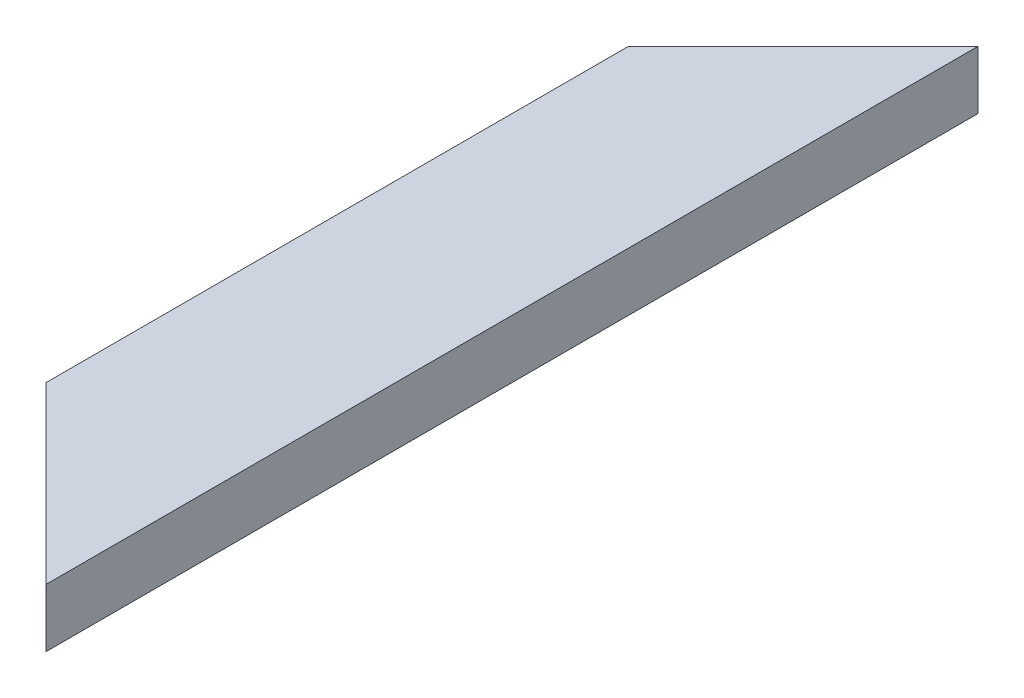
ISO-10303-21;
HEADER;
FILE_DESCRIPTION(('STEP AP214'),'2;1');
FILE_NAME('part.step','',(''),(''),'','','');
FILE_SCHEMA(('AUTOMOTIVE_DESIGN { 1 0 10303 214 1 1 1 1 }'));
ENDSEC;
DATA;
#1=APPLICATION_CONTEXT('core data for automotive mechanical design processes');
#2=APPLICATION_PROTOCOL_DEFINITION('international standard','automotive_design',2000,#1);
#3=PRODUCT_CONTEXT('',#1,'mechanical');
#4=PRODUCT('Part','Part','',(#3));
#5=PRODUCT_RELATED_PRODUCT_CATEGORY('part','',(#4));
#6=PRODUCT_DEFINITION_FORMATION('','',#4);
#7=PRODUCT_DEFINITION_CONTEXT('part definition',#1,'design');
#8=PRODUCT_DEFINITION('design','',#6,#7);
#9=PRODUCT_DEFINITION_SHAPE('','',#8);
#10=(LENGTH_UNIT() NAMED_UNIT(*) SI_UNIT(.MILLI.,.METRE.));
#11=(NAMED_UNIT(*) PLANE_ANGLE_UNIT() SI_UNIT($,.RADIAN.));
#12=(NAMED_UNIT(*) SI_UNIT($,.STERADIAN.) SOLID_ANGLE_UNIT());
#13=UNCERTAINTY_MEASURE_WITH_UNIT(LENGTH_MEASURE(1.E-05),#10,'distance_accuracy_value','');
#14=(GEOMETRIC_REPRESENTATION_CONTEXT(3) GLOBAL_UNCERTAINTY_ASSIGNED_CONTEXT((#13)) GLOBAL_UNIT_ASSIGNED_CONTEXT((#10,
#11,#12)) REPRESENTATION_CONTEXT('',''));
#15=CARTESIAN_POINT('',(0.,0.,0.));
#16=DIRECTION('',(0.,0.,1.));
#17=DIRECTION('',(1.,0.,0.));
#18=AXIS2_PLACEMENT_3D('',#15,#16,#17);
#19=CARTESIAN_POINT('',(2.22044604925031E-13,1.11022302462516E-13,812.8));
#20=DIRECTION('',(1.,0.,0.));
#21=DIRECTION('',(0.,0.,-1.));
#22=AXIS2_PLACEMENT_3D('',#19,#20,#21);
#23=PLANE('',#22);
#24=DIRECTION('',(0.,0.,-1.));
#25=VECTOR('',#24,1.);
#26=CARTESIAN_POINT('',(2.22044604925031E-13,1.11022302462516E-13,812.8));
#27=LINE('',#26,#25);
#28=CARTESIAN_POINT('',(1.11022302462516E-13,1.11022302462516E-13,660.4));
#29=VERTEX_POINT('',#28);
#30=CARTESIAN_POINT('',(0.,0.,152.400000000003));
#31=VERTEX_POINT('',#30);
#32=EDGE_CURVE('E91',#29,#31,#27,.T.);
#33=ORIENTED_EDGE('',*,*,#32,.T.);
#34=DIRECTION('',(0.,1.,0.));
#35=VECTOR('',#34,1.);
#36=CARTESIAN_POINT('',(2.22044604925031E-13,-711.2,152.400000000003));
#37=LINE('',#36,#35);
#38=CARTESIAN_POINT('',(0.,-50.8,152.400000000003));
#39=VERTEX_POINT('',#38);
#40=EDGE_CURVE('E74',#39,#31,#37,.T.);
#41=ORIENTED_EDGE('',*,*,#40,.F.);
#42=DIRECTION('',(0.,0.,-1.));
#43=VECTOR('',#42,1.);
#44=CARTESIAN_POINT('',(3.33066907387547E-13,-50.7999999999998,812.8));
#45=LINE('',#44,#43);
#46=CARTESIAN_POINT('',(1.11022302462516E-13,-50.7999999999998,660.4));
#47=VERTEX_POINT('',#46);
#48=EDGE_CURVE('E11',#47,#39,#45,.T.);
#49=ORIENTED_EDGE('',*,*,#48,.F.);
#50=DIRECTION('',(0.,1.,0.));
#51=VECTOR('',#50,1.);
#52=CARTESIAN_POINT('',(4.44089209850063E-13,-711.2,660.399999999999));
#53=LINE('',#52,#51);
#54=EDGE_CURVE('E95',#47,#29,#53,.T.);
#55=ORIENTED_EDGE('',*,*,#54,.T.);
#56=EDGE_LOOP('',(#33,#41,#49,#55));
#57=FACE_BOUND('',#56,.T.);
#58=ADVANCED_FACE('F38',(#57),#23,.F.);
#59=CARTESIAN_POINT('',(3.33066907387547E-13,-50.7999999999998,812.8));
#60=DIRECTION('',(0.,1.,0.));
#61=DIRECTION('',(0.,0.,1.));
#62=AXIS2_PLACEMENT_3D('',#59,#60,#61);
#63=PLANE('',#62);
#64=ORIENTED_EDGE('',*,*,#48,.T.);
#65=DIRECTION('',(0.707106781186541,0.,-0.707106781186554));
#66=VECTOR('',#65,1.);
#67=CARTESIAN_POINT('',(-330.199999999998,-50.7999999999997,482.600000000007));
#68=LINE('',#67,#66);
#69=CARTESIAN_POINT('',(152.4,-50.8000000000001,0.));
#70=VERTEX_POINT('',#69);
#71=EDGE_CURVE('E80',#39,#70,#68,.T.);
#72=ORIENTED_EDGE('',*,*,#71,.T.);
#73=DIRECTION('',(0.,0.,-1.));
#74=VECTOR('',#73,1.);
#75=CARTESIAN_POINT('',(152.4,-50.8000000000001,812.8));
#76=LINE('',#75,#74);
#77=CARTESIAN_POINT('',(152.4,-50.8000000000001,812.8));
#78=VERTEX_POINT('',#77);
#79=EDGE_CURVE('E47',#78,#70,#76,.T.);
#80=ORIENTED_EDGE('',*,*,#79,.F.);
#81=DIRECTION('',(-0.707106781186546,0.,-0.707106781186549));
#82=VECTOR('',#81,1.);
#83=CARTESIAN_POINT('',(76.2000000000005,-50.8,736.6));
#84=LINE('',#83,#82);
#85=EDGE_CURVE('E53',#78,#47,#84,.T.);
#86=ORIENTED_EDGE('',*,*,#85,.T.);
#87=EDGE_LOOP('',(#64,#72,#80,#86));
#88=FACE_BOUND('',#87,.T.);
#89=ADVANCED_FACE('F115',(#88),#63,.F.);
#90=CARTESIAN_POINT('',(152.4,0.,812.8));
#91=DIRECTION('',(-1.,0.,0.));
#92=DIRECTION('',(0.,-1.,0.));
#93=AXIS2_PLACEMENT_3D('',#90,#91,#92);
#94=PLANE('',#93);
#95=DIRECTION('',(0.,1.,0.));
#96=VECTOR('',#95,1.);
#97=CARTESIAN_POINT('',(152.4,-1.11022302462516E-13,0.));
#98=LINE('',#97,#96);
#99=CARTESIAN_POINT('',(152.4,-1.11022302462516E-13,0.));
#100=VERTEX_POINT('',#99);
#101=EDGE_CURVE('E105',#70,#100,#98,.T.);
#102=ORIENTED_EDGE('',*,*,#101,.T.);
#103=DIRECTION('',(0.,0.,-1.));
#104=VECTOR('',#103,1.);
#105=CARTESIAN_POINT('',(152.4,0.,812.8));
#106=LINE('',#105,#104);
#107=CARTESIAN_POINT('',(152.4,0.,812.8));
#108=VERTEX_POINT('',#107);
#109=EDGE_CURVE('E93',#108,#100,#106,.T.);
#110=ORIENTED_EDGE('',*,*,#109,.F.);
#111=DIRECTION('',(0.,1.,0.));
#112=VECTOR('',#111,1.);
#113=CARTESIAN_POINT('',(152.4,0.,812.8));
#114=LINE('',#113,#112);
#115=EDGE_CURVE('E99',#78,#108,#114,.T.);
#116=ORIENTED_EDGE('',*,*,#115,.F.);
#117=ORIENTED_EDGE('',*,*,#79,.T.);
#118=EDGE_LOOP('',(#102,#110,#116,#117));
#119=FACE_BOUND('',#118,.T.);
#120=ADVANCED_FACE('F113',(#119),#94,.F.);
#121=CARTESIAN_POINT('',(2.22044604925031E-13,1.11022302462516E-13,812.8));
#122=DIRECTION('',(0.,-1.,0.));
#123=DIRECTION('',(0.,0.,-1.));
#124=AXIS2_PLACEMENT_3D('',#121,#122,#123);
#125=PLANE('',#124);
#126=ORIENTED_EDGE('',*,*,#109,.T.);
#127=DIRECTION('',(0.707106781186541,0.,-0.707106781186554));
#128=VECTOR('',#127,1.);
#129=CARTESIAN_POINT('',(152.4,-1.11022302462516E-13,0.));
#130=LINE('',#129,#128);
#131=EDGE_CURVE('E77',#31,#100,#130,.T.);
#132=ORIENTED_EDGE('',*,*,#131,.F.);
#133=ORIENTED_EDGE('',*,*,#32,.F.);
#134=DIRECTION('',(-0.707106781186546,0.,-0.707106781186549));
#135=VECTOR('',#134,1.);
#136=CARTESIAN_POINT('',(152.4,0.,812.8));
#137=LINE('',#136,#135);
#138=EDGE_CURVE('E124',#108,#29,#137,.T.);
#139=ORIENTED_EDGE('',*,*,#138,.F.);
#140=EDGE_LOOP('',(#126,#132,#133,#139));
#141=FACE_BOUND('',#140,.T.);
#142=ADVANCED_FACE('F89',(#141),#125,.F.);
#143=CARTESIAN_POINT('',(152.4,-711.2,-1.11022302462516E-13));
#144=DIRECTION('',(0.707106781186554,0.,0.707106781186541));
#145=DIRECTION('',(0.707106781186541,0.,-0.707106781186554));
#146=AXIS2_PLACEMENT_3D('',#143,#144,#145);
#147=PLANE('',#146);
#148=ORIENTED_EDGE('',*,*,#40,.T.);
#149=ORIENTED_EDGE('',*,*,#131,.T.);
#150=ORIENTED_EDGE('',*,*,#101,.F.);
#151=ORIENTED_EDGE('',*,*,#71,.F.);
#152=EDGE_LOOP('',(#148,#149,#150,#151));
#153=FACE_BOUND('',#152,.T.);
#154=ADVANCED_FACE('F76',(#153),#147,.F.);
#155=CARTESIAN_POINT('',(152.4,-711.2,812.8));
#156=DIRECTION('',(0.707106781186548,0.,-0.707106781186546));
#157=DIRECTION('',(-0.707106781186546,0.,-0.707106781186549));
#158=AXIS2_PLACEMENT_3D('',#155,#156,#157);
#159=PLANE('',#158);
#160=ORIENTED_EDGE('',*,*,#115,.T.);
#161=ORIENTED_EDGE('',*,*,#138,.T.);
#162=ORIENTED_EDGE('',*,*,#54,.F.);
#163=ORIENTED_EDGE('',*,*,#85,.F.);
#164=EDGE_LOOP('',(#160,#161,#162,#163));
#165=FACE_BOUND('',#164,.T.);
#166=ADVANCED_FACE('F127',(#165),#159,.F.);
#167=CLOSED_SHELL('',(#58,#89,#120,#142,#154,#166));
#168=MANIFOLD_SOLID_BREP('B2',#167);
#169=ADVANCED_BREP_SHAPE_REPRESENTATION('',(#18,#168),#14);
#170=SHAPE_DEFINITION_REPRESENTATION(#9,#169);
ENDSEC;
END-ISO-10303-21;
